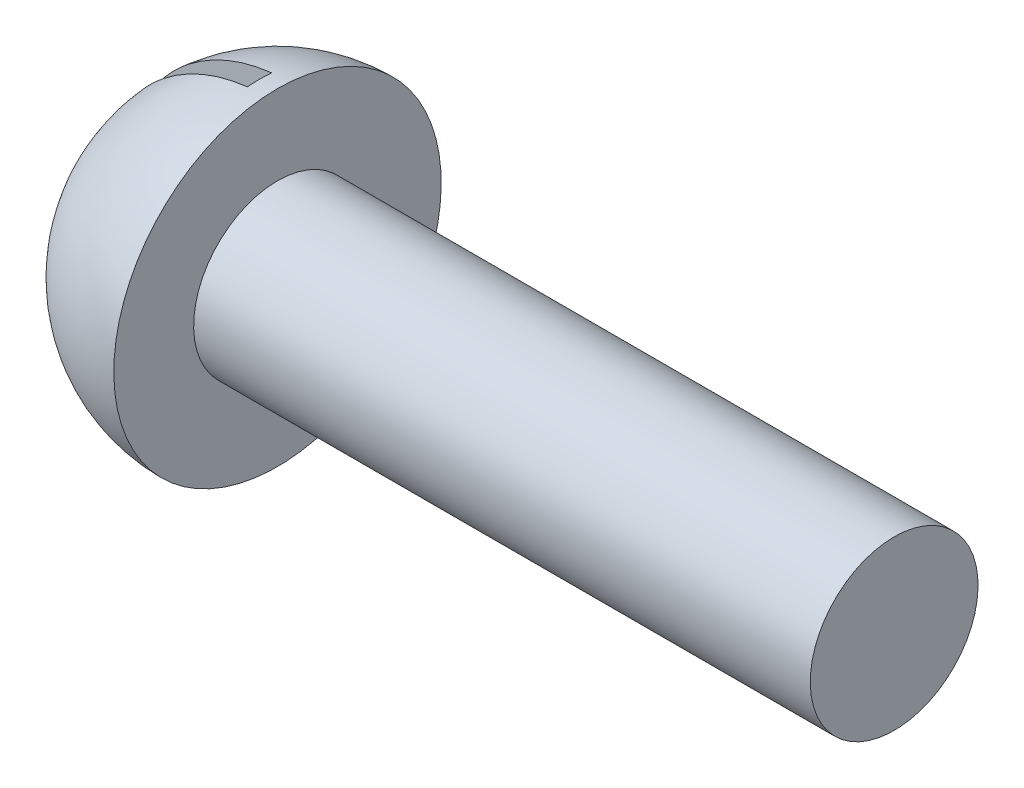
ISO-10303-21;
HEADER;
FILE_DESCRIPTION(('STEP AP214'),'2;1');
FILE_NAME('part.step','',(''),(''),'','','');
FILE_SCHEMA(('AUTOMOTIVE_DESIGN { 1 0 10303 214 1 1 1 1 }'));
ENDSEC;
DATA;
#1=APPLICATION_CONTEXT('core data for automotive mechanical design processes');
#2=APPLICATION_PROTOCOL_DEFINITION('international standard','automotive_design',2000,#1);
#3=PRODUCT_CONTEXT('',#1,'mechanical');
#4=PRODUCT('Part','Part','',(#3));
#5=PRODUCT_RELATED_PRODUCT_CATEGORY('part','',(#4));
#6=PRODUCT_DEFINITION_FORMATION('','',#4);
#7=PRODUCT_DEFINITION_CONTEXT('part definition',#1,'design');
#8=PRODUCT_DEFINITION('design','',#6,#7);
#9=PRODUCT_DEFINITION_SHAPE('','',#8);
#10=(LENGTH_UNIT() NAMED_UNIT(*) SI_UNIT(.MILLI.,.METRE.));
#11=(NAMED_UNIT(*) PLANE_ANGLE_UNIT() SI_UNIT($,.RADIAN.));
#12=(NAMED_UNIT(*) SI_UNIT($,.STERADIAN.) SOLID_ANGLE_UNIT());
#13=UNCERTAINTY_MEASURE_WITH_UNIT(LENGTH_MEASURE(1.E-05),#10,'distance_accuracy_value','');
#14=(GEOMETRIC_REPRESENTATION_CONTEXT(3) GLOBAL_UNCERTAINTY_ASSIGNED_CONTEXT((#13)) GLOBAL_UNIT_ASSIGNED_CONTEXT((#10,
#11,#12)) REPRESENTATION_CONTEXT('',''));
#15=CARTESIAN_POINT('',(0.,0.,0.));
#16=DIRECTION('',(0.,0.,1.));
#17=DIRECTION('',(1.,0.,0.));
#18=AXIS2_PLACEMENT_3D('',#15,#16,#17);
#19=CARTESIAN_POINT('',(0.,0.,0.));
#20=DIRECTION('',(1.,0.,0.));
#21=DIRECTION('',(0.,1.,0.));
#22=AXIS2_PLACEMENT_3D('',#19,#20,#21);
#23=SPHERICAL_SURFACE('',#22,3.37147692547211);
#24=CARTESIAN_POINT('',(0.,0.,0.));
#25=DIRECTION('',(1.,0.,0.));
#26=DIRECTION('',(0.,1.,0.));
#27=AXIS2_PLACEMENT_3D('',#24,#25,#26);
#28=CIRCLE('',#27,3.37147692547211);
#29=CARTESIAN_POINT('',(0.,3.37147692547211,0.));
#30=VERTEX_POINT('',#29);
#31=EDGE_CURVE('E78',#30,#30,#28,.T.);
#32=ORIENTED_EDGE('',*,*,#31,.F.);
#33=EDGE_LOOP('',(#32));
#34=FACE_BOUND('',#33,.T.);
#35=CARTESIAN_POINT('',(0.,0.,0.249999999999999));
#36=DIRECTION('',(0.,0.,1.));
#37=DIRECTION('',(0.,-1.,0.));
#38=AXIS2_PLACEMENT_3D('',#35,#36,#37);
#39=CIRCLE('',#38,3.36219521428945);
#40=CARTESIAN_POINT('',(-0.37147692547211,-3.34161062256402,0.249999999999999));
#41=VERTEX_POINT('',#40);
#42=CARTESIAN_POINT('',(-0.37147692547211,3.34161062256401,0.25));
#43=VERTEX_POINT('',#42);
#44=EDGE_CURVE('E66',#41,#43,#39,.F.);
#45=ORIENTED_EDGE('',*,*,#44,.F.);
#46=CARTESIAN_POINT('',(-0.37147692547211,0.,0.));
#47=DIRECTION('',(-1.,0.,0.));
#48=DIRECTION('',(0.,0.,1.));
#49=AXIS2_PLACEMENT_3D('',#46,#47,#48);
#50=CIRCLE('',#49,3.35094935097991);
#51=CARTESIAN_POINT('',(-0.37147692547211,-3.34161062256402,-0.249999999999999));
#52=VERTEX_POINT('',#51);
#53=EDGE_CURVE('E11',#41,#52,#50,.F.);
#54=ORIENTED_EDGE('',*,*,#53,.T.);
#55=CARTESIAN_POINT('',(0.,0.,-0.249999999999999));
#56=DIRECTION('',(0.,0.,-1.));
#57=DIRECTION('',(0.,1.,0.));
#58=AXIS2_PLACEMENT_3D('',#55,#56,#57);
#59=CIRCLE('',#58,3.36219521428945);
#60=CARTESIAN_POINT('',(-0.37147692547211,3.34161062256401,-0.25));
#61=VERTEX_POINT('',#60);
#62=EDGE_CURVE('E38',#61,#52,#59,.F.);
#63=ORIENTED_EDGE('',*,*,#62,.F.);
#64=EDGE_CURVE('E44',#61,#43,#50,.F.);
#65=ORIENTED_EDGE('',*,*,#64,.T.);
#66=EDGE_LOOP('',(#45,#54,#63,#65));
#67=FACE_BOUND('',#66,.T.);
#68=ADVANCED_FACE('F34',(#34,#67),#23,.T.);
#69=CARTESIAN_POINT('',(12.7,0.,0.));
#70=DIRECTION('',(1.,0.,0.));
#71=DIRECTION('',(0.,1.,0.));
#72=AXIS2_PLACEMENT_3D('',#69,#70,#71);
#73=PLANE('',#72);
#74=CARTESIAN_POINT('',(12.7,0.,0.));
#75=DIRECTION('',(1.,0.,0.));
#76=DIRECTION('',(0.,1.,0.));
#77=AXIS2_PLACEMENT_3D('',#74,#75,#76);
#78=CIRCLE('',#77,1.7272);
#79=CARTESIAN_POINT('',(12.7,1.7272,0.));
#80=VERTEX_POINT('',#79);
#81=EDGE_CURVE('E67',#80,#80,#78,.T.);
#82=ORIENTED_EDGE('',*,*,#81,.T.);
#83=EDGE_LOOP('',(#82));
#84=FACE_BOUND('',#83,.T.);
#85=ADVANCED_FACE('F36',(#84),#73,.T.);
#86=CARTESIAN_POINT('',(58.2164476219494,0.,0.));
#87=DIRECTION('',(1.,0.,0.));
#88=DIRECTION('',(0.,1.,0.));
#89=AXIS2_PLACEMENT_3D('',#86,#87,#88);
#90=CYLINDRICAL_SURFACE('',#89,1.7272);
#91=CARTESIAN_POINT('',(0.,0.,0.));
#92=DIRECTION('',(1.,0.,0.));
#93=DIRECTION('',(0.,1.,0.));
#94=AXIS2_PLACEMENT_3D('',#91,#92,#93);
#95=CIRCLE('',#94,1.7272);
#96=CARTESIAN_POINT('',(0.,1.7272,0.));
#97=VERTEX_POINT('',#96);
#98=EDGE_CURVE('E75',#97,#97,#95,.T.);
#99=ORIENTED_EDGE('',*,*,#98,.T.);
#100=EDGE_LOOP('',(#99));
#101=FACE_BOUND('',#100,.T.);
#102=ORIENTED_EDGE('',*,*,#81,.F.);
#103=EDGE_LOOP('',(#102));
#104=FACE_BOUND('',#103,.T.);
#105=ADVANCED_FACE('F91',(#101,#104),#90,.T.);
#106=CARTESIAN_POINT('',(0.,3.37147692547211,0.));
#107=DIRECTION('',(1.,0.,0.));
#108=DIRECTION('',(0.,1.,0.));
#109=AXIS2_PLACEMENT_3D('',#106,#107,#108);
#110=PLANE('',#109);
#111=ORIENTED_EDGE('',*,*,#31,.T.);
#112=EDGE_LOOP('',(#111));
#113=FACE_BOUND('',#112,.T.);
#114=ORIENTED_EDGE('',*,*,#98,.F.);
#115=EDGE_LOOP('',(#114));
#116=FACE_BOUND('',#115,.T.);
#117=ADVANCED_FACE('F83',(#113,#116),#110,.T.);
#118=CARTESIAN_POINT('',(-0.37147692547211,4.34175699506477,-0.25));
#119=DIRECTION('',(0.,0.,-1.));
#120=DIRECTION('',(0.,1.,0.));
#121=AXIS2_PLACEMENT_3D('',#118,#119,#120);
#122=PLANE('',#121);
#123=ORIENTED_EDGE('',*,*,#62,.T.);
#124=DIRECTION('',(0.,-1.,0.));
#125=VECTOR('',#124,1.);
#126=CARTESIAN_POINT('',(-0.37147692547211,4.34175699506477,-0.25));
#127=LINE('',#126,#125);
#128=EDGE_CURVE('E62',#61,#52,#127,.T.);
#129=ORIENTED_EDGE('',*,*,#128,.F.);
#130=EDGE_LOOP('',(#123,#129));
#131=FACE_BOUND('',#130,.T.);
#132=ADVANCED_FACE('F69',(#131),#122,.F.);
#133=CARTESIAN_POINT('',(-0.37147692547211,4.34175699506477,0.25));
#134=DIRECTION('',(0.,0.,1.));
#135=DIRECTION('',(0.,-1.,0.));
#136=AXIS2_PLACEMENT_3D('',#133,#134,#135);
#137=PLANE('',#136);
#138=ORIENTED_EDGE('',*,*,#44,.T.);
#139=DIRECTION('',(0.,1.,0.));
#140=VECTOR('',#139,1.);
#141=CARTESIAN_POINT('',(-0.37147692547211,4.34175699506477,0.25));
#142=LINE('',#141,#140);
#143=EDGE_CURVE('E51',#41,#43,#142,.T.);
#144=ORIENTED_EDGE('',*,*,#143,.F.);
#145=EDGE_LOOP('',(#138,#144));
#146=FACE_BOUND('',#145,.T.);
#147=ADVANCED_FACE('F116',(#146),#137,.F.);
#148=CARTESIAN_POINT('',(-0.37147692547211,-4.40765567008675,-0.249999999999999));
#149=DIRECTION('',(-1.,0.,0.));
#150=DIRECTION('',(0.,0.,1.));
#151=AXIS2_PLACEMENT_3D('',#148,#149,#150);
#152=PLANE('',#151);
#153=ORIENTED_EDGE('',*,*,#143,.T.);
#154=ORIENTED_EDGE('',*,*,#64,.F.);
#155=ORIENTED_EDGE('',*,*,#128,.T.);
#156=ORIENTED_EDGE('',*,*,#53,.F.);
#157=EDGE_LOOP('',(#153,#154,#155,#156));
#158=FACE_BOUND('',#157,.T.);
#159=ADVANCED_FACE('F61',(#158),#152,.T.);
#160=CLOSED_SHELL('',(#68,#85,#105,#117,#132,#147,#159));
#161=MANIFOLD_SOLID_BREP('B2',#160);
#162=ADVANCED_BREP_SHAPE_REPRESENTATION('',(#18,#161),#14);
#163=SHAPE_DEFINITION_REPRESENTATION(#9,#162);
ENDSEC;
END-ISO-10303-21;
